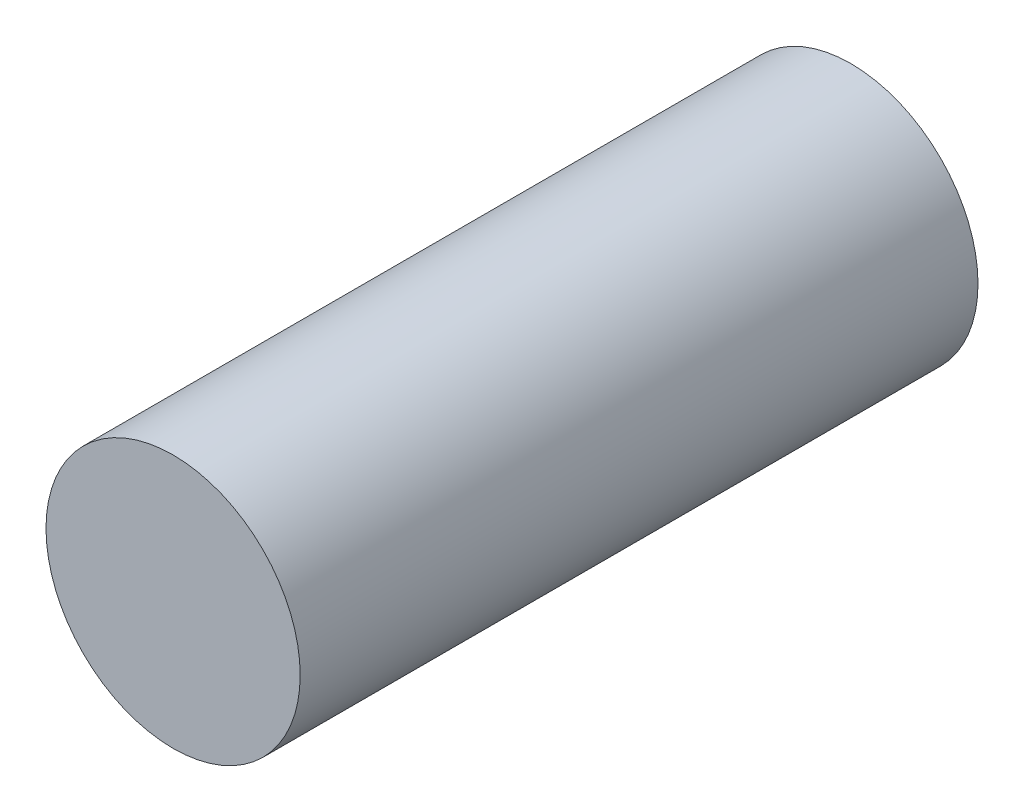
ISO-10303-21;
HEADER;
FILE_DESCRIPTION(('STEP AP214'),'2;1');
FILE_NAME('part.step','',(''),(''),'','','');
FILE_SCHEMA(('AUTOMOTIVE_DESIGN { 1 0 10303 214 1 1 1 1 }'));
ENDSEC;
DATA;
#1=APPLICATION_CONTEXT('core data for automotive mechanical design processes');
#2=APPLICATION_PROTOCOL_DEFINITION('international standard','automotive_design',2000,#1);
#3=PRODUCT_CONTEXT('',#1,'mechanical');
#4=PRODUCT('Part','Part','',(#3));
#5=PRODUCT_RELATED_PRODUCT_CATEGORY('part','',(#4));
#6=PRODUCT_DEFINITION_FORMATION('','',#4);
#7=PRODUCT_DEFINITION_CONTEXT('part definition',#1,'design');
#8=PRODUCT_DEFINITION('design','',#6,#7);
#9=PRODUCT_DEFINITION_SHAPE('','',#8);
#10=(LENGTH_UNIT() NAMED_UNIT(*) SI_UNIT(.MILLI.,.METRE.));
#11=(NAMED_UNIT(*) PLANE_ANGLE_UNIT() SI_UNIT($,.RADIAN.));
#12=(NAMED_UNIT(*) SI_UNIT($,.STERADIAN.) SOLID_ANGLE_UNIT());
#13=UNCERTAINTY_MEASURE_WITH_UNIT(LENGTH_MEASURE(1.E-05),#10,'distance_accuracy_value','');
#14=(GEOMETRIC_REPRESENTATION_CONTEXT(3) GLOBAL_UNCERTAINTY_ASSIGNED_CONTEXT((#13)) GLOBAL_UNIT_ASSIGNED_CONTEXT((#10,
#11,#12)) REPRESENTATION_CONTEXT('',''));
#15=CARTESIAN_POINT('',(0.,0.,0.));
#16=DIRECTION('',(0.,0.,1.));
#17=DIRECTION('',(1.,0.,0.));
#18=AXIS2_PLACEMENT_3D('',#15,#16,#17);
#19=CARTESIAN_POINT('',(0.,0.,40.64));
#20=DIRECTION('',(0.,0.,-1.));
#21=DIRECTION('',(-1.,0.,0.));
#22=AXIS2_PLACEMENT_3D('',#19,#20,#21);
#23=CYLINDRICAL_SURFACE('',#22,7.62);
#24=CARTESIAN_POINT('',(0.,0.,40.64));
#25=DIRECTION('',(0.,0.,1.));
#26=DIRECTION('',(1.,0.,0.));
#27=AXIS2_PLACEMENT_3D('',#24,#25,#26);
#28=CIRCLE('',#27,7.62);
#29=CARTESIAN_POINT('',(7.62,0.,40.64));
#30=VERTEX_POINT('',#29);
#31=EDGE_CURVE('E10',#30,#30,#28,.T.);
#32=ORIENTED_EDGE('',*,*,#31,.F.);
#33=EDGE_LOOP('',(#32));
#34=FACE_BOUND('',#33,.T.);
#35=CARTESIAN_POINT('',(0.,0.,0.));
#36=DIRECTION('',(0.,0.,1.));
#37=DIRECTION('',(1.,0.,0.));
#38=AXIS2_PLACEMENT_3D('',#35,#36,#37);
#39=CIRCLE('',#38,7.62);
#40=CARTESIAN_POINT('',(7.62,0.,0.));
#41=VERTEX_POINT('',#40);
#42=EDGE_CURVE('E49',#41,#41,#39,.T.);
#43=ORIENTED_EDGE('',*,*,#42,.T.);
#44=EDGE_LOOP('',(#43));
#45=FACE_BOUND('',#44,.T.);
#46=ADVANCED_FACE('F50',(#34,#45),#23,.T.);
#47=CARTESIAN_POINT('',(0.,0.,40.64));
#48=DIRECTION('',(0.,0.,1.));
#49=DIRECTION('',(1.,0.,0.));
#50=AXIS2_PLACEMENT_3D('',#47,#48,#49);
#51=PLANE('',#50);
#52=ORIENTED_EDGE('',*,*,#31,.T.);
#53=EDGE_LOOP('',(#52));
#54=FACE_BOUND('',#53,.T.);
#55=ADVANCED_FACE('F66',(#54),#51,.T.);
#56=CARTESIAN_POINT('',(0.,0.,0.));
#57=DIRECTION('',(0.,0.,1.));
#58=DIRECTION('',(1.,0.,0.));
#59=AXIS2_PLACEMENT_3D('',#56,#57,#58);
#60=PLANE('',#59);
#61=ORIENTED_EDGE('',*,*,#42,.F.);
#62=EDGE_LOOP('',(#61));
#63=FACE_BOUND('',#62,.T.);
#64=ADVANCED_FACE('F61',(#63),#60,.F.);
#65=CLOSED_SHELL('',(#46,#55,#64));
#66=MANIFOLD_SOLID_BREP('B2',#65);
#67=ADVANCED_BREP_SHAPE_REPRESENTATION('',(#18,#66),#14);
#68=SHAPE_DEFINITION_REPRESENTATION(#9,#67);
ENDSEC;
END-ISO-10303-21;
